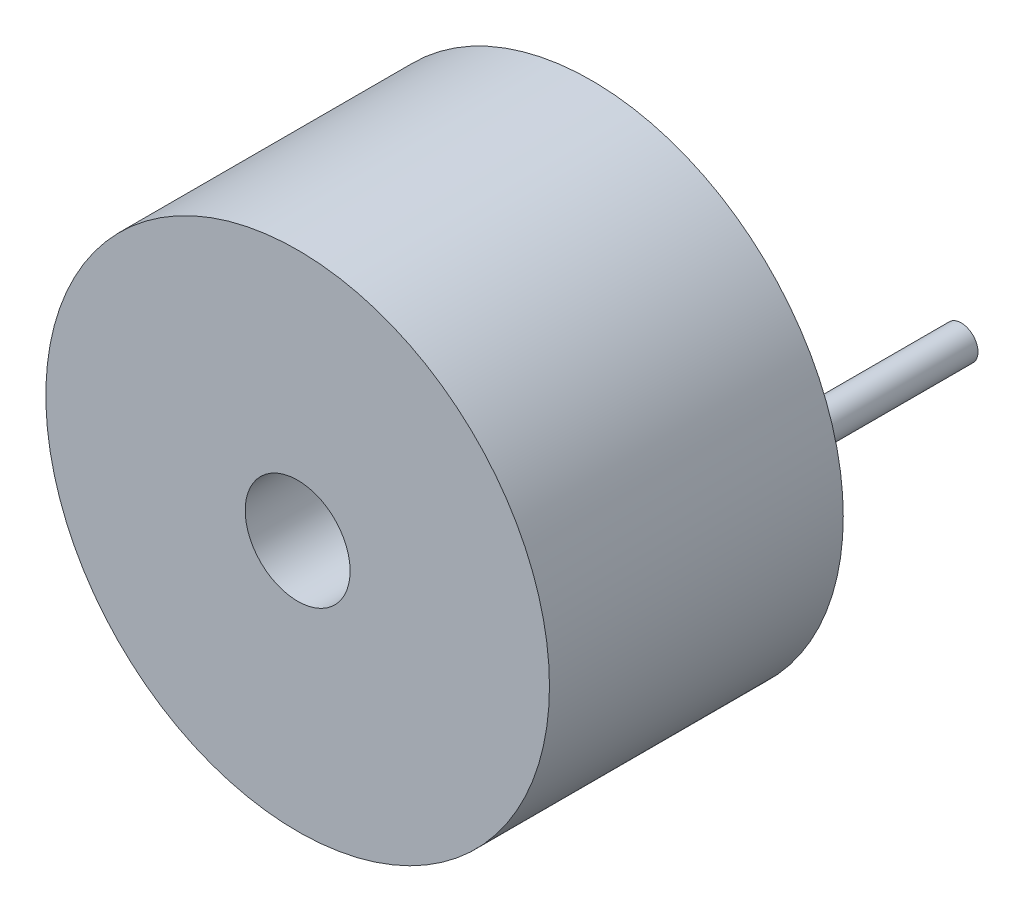
ISO-10303-21;
HEADER;
FILE_DESCRIPTION(('STEP AP214'),'2;1');
FILE_NAME('part.step','',(''),(''),'','','');
FILE_SCHEMA(('AUTOMOTIVE_DESIGN { 1 0 10303 214 1 1 1 1 }'));
ENDSEC;
DATA;
#1=APPLICATION_CONTEXT('core data for automotive mechanical design processes');
#2=APPLICATION_PROTOCOL_DEFINITION('international standard','automotive_design',2000,#1);
#3=PRODUCT_CONTEXT('',#1,'mechanical');
#4=PRODUCT('Part','Part','',(#3));
#5=PRODUCT_RELATED_PRODUCT_CATEGORY('part','',(#4));
#6=PRODUCT_DEFINITION_FORMATION('','',#4);
#7=PRODUCT_DEFINITION_CONTEXT('part definition',#1,'design');
#8=PRODUCT_DEFINITION('design','',#6,#7);
#9=PRODUCT_DEFINITION_SHAPE('','',#8);
#10=(LENGTH_UNIT() NAMED_UNIT(*) SI_UNIT(.MILLI.,.METRE.));
#11=(NAMED_UNIT(*) PLANE_ANGLE_UNIT() SI_UNIT($,.RADIAN.));
#12=(NAMED_UNIT(*) SI_UNIT($,.STERADIAN.) SOLID_ANGLE_UNIT());
#13=UNCERTAINTY_MEASURE_WITH_UNIT(LENGTH_MEASURE(1.E-05),#10,'distance_accuracy_value','');
#14=(GEOMETRIC_REPRESENTATION_CONTEXT(3) GLOBAL_UNCERTAINTY_ASSIGNED_CONTEXT((#13)) GLOBAL_UNIT_ASSIGNED_CONTEXT((#10,
#11,#12)) REPRESENTATION_CONTEXT('',''));
#15=CARTESIAN_POINT('',(0.,0.,0.));
#16=DIRECTION('',(0.,0.,1.));
#17=DIRECTION('',(1.,0.,0.));
#18=AXIS2_PLACEMENT_3D('',#15,#16,#17);
#19=CARTESIAN_POINT('',(0.,0.,0.));
#20=DIRECTION('',(0.,0.,1.));
#21=DIRECTION('',(1.,0.,0.));
#22=AXIS2_PLACEMENT_3D('',#19,#20,#21);
#23=PLANE('',#22);
#24=CARTESIAN_POINT('',(3.81,0.,0.));
#25=DIRECTION('',(0.,0.,1.));
#26=DIRECTION('',(1.,0.,0.));
#27=AXIS2_PLACEMENT_3D('',#24,#25,#26);
#28=CIRCLE('',#27,0.4);
#29=CARTESIAN_POINT('',(4.21,0.,0.));
#30=VERTEX_POINT('',#29);
#31=EDGE_CURVE('E41',#30,#30,#28,.F.);
#32=ORIENTED_EDGE('',*,*,#31,.F.);
#33=EDGE_LOOP('',(#32));
#34=FACE_BOUND('',#33,.T.);
#35=CARTESIAN_POINT('',(0.,0.,0.));
#36=DIRECTION('',(0.,0.,1.));
#37=DIRECTION('',(1.,0.,0.));
#38=AXIS2_PLACEMENT_3D('',#35,#36,#37);
#39=CIRCLE('',#38,6.);
#40=CARTESIAN_POINT('',(6.,0.,0.));
#41=VERTEX_POINT('',#40);
#42=EDGE_CURVE('E49',#41,#41,#39,.T.);
#43=ORIENTED_EDGE('',*,*,#42,.F.);
#44=EDGE_LOOP('',(#43));
#45=FACE_BOUND('',#44,.T.);
#46=CARTESIAN_POINT('',(-3.81,0.,0.));
#47=DIRECTION('',(0.,0.,1.));
#48=DIRECTION('',(1.,0.,0.));
#49=AXIS2_PLACEMENT_3D('',#46,#47,#48);
#50=CIRCLE('',#49,0.4);
#51=CARTESIAN_POINT('',(-3.41,0.,0.));
#52=VERTEX_POINT('',#51);
#53=EDGE_CURVE('E10',#52,#52,#50,.F.);
#54=ORIENTED_EDGE('',*,*,#53,.F.);
#55=EDGE_LOOP('',(#54));
#56=FACE_BOUND('',#55,.T.);
#57=ADVANCED_FACE('F34',(#34,#45,#56),#23,.F.);
#58=CARTESIAN_POINT('',(0.,0.,7.));
#59=DIRECTION('',(0.,0.,-1.));
#60=DIRECTION('',(-1.,0.,0.));
#61=AXIS2_PLACEMENT_3D('',#58,#59,#60);
#62=CYLINDRICAL_SURFACE('',#61,6.);
#63=CARTESIAN_POINT('',(0.,0.,7.));
#64=DIRECTION('',(0.,0.,1.));
#65=DIRECTION('',(1.,0.,0.));
#66=AXIS2_PLACEMENT_3D('',#63,#64,#65);
#67=CIRCLE('',#66,6.);
#68=CARTESIAN_POINT('',(6.,0.,7.));
#69=VERTEX_POINT('',#68);
#70=EDGE_CURVE('E45',#69,#69,#67,.T.);
#71=ORIENTED_EDGE('',*,*,#70,.F.);
#72=EDGE_LOOP('',(#71));
#73=FACE_BOUND('',#72,.T.);
#74=ORIENTED_EDGE('',*,*,#42,.T.);
#75=EDGE_LOOP('',(#74));
#76=FACE_BOUND('',#75,.T.);
#77=ADVANCED_FACE('F36',(#73,#76),#62,.T.);
#78=CARTESIAN_POINT('',(0.,0.,7.));
#79=DIRECTION('',(0.,0.,1.));
#80=DIRECTION('',(1.,0.,0.));
#81=AXIS2_PLACEMENT_3D('',#78,#79,#80);
#82=PLANE('',#81);
#83=CARTESIAN_POINT('',(0.,0.,7.));
#84=DIRECTION('',(0.,0.,1.));
#85=DIRECTION('',(1.,0.,0.));
#86=AXIS2_PLACEMENT_3D('',#83,#84,#85);
#87=CIRCLE('',#86,1.25);
#88=CARTESIAN_POINT('',(1.25,0.,7.));
#89=VERTEX_POINT('',#88);
#90=EDGE_CURVE('E63',#89,#89,#87,.T.);
#91=ORIENTED_EDGE('',*,*,#90,.F.);
#92=EDGE_LOOP('',(#91));
#93=FACE_BOUND('',#92,.T.);
#94=ORIENTED_EDGE('',*,*,#70,.T.);
#95=EDGE_LOOP('',(#94));
#96=FACE_BOUND('',#95,.T.);
#97=ADVANCED_FACE('F69',(#93,#96),#82,.T.);
#98=CARTESIAN_POINT('',(3.81,0.,-5.));
#99=DIRECTION('',(0.,0.,1.));
#100=DIRECTION('',(1.,0.,0.));
#101=AXIS2_PLACEMENT_3D('',#98,#99,#100);
#102=CYLINDRICAL_SURFACE('',#101,0.4);
#103=CARTESIAN_POINT('',(3.81,0.,-5.));
#104=DIRECTION('',(0.,0.,-1.));
#105=DIRECTION('',(-1.,0.,0.));
#106=AXIS2_PLACEMENT_3D('',#103,#104,#105);
#107=CIRCLE('',#106,0.4);
#108=CARTESIAN_POINT('',(3.41,0.,-5.));
#109=VERTEX_POINT('',#108);
#110=EDGE_CURVE('E54',#109,#109,#107,.T.);
#111=ORIENTED_EDGE('',*,*,#110,.F.);
#112=EDGE_LOOP('',(#111));
#113=FACE_BOUND('',#112,.T.);
#114=ORIENTED_EDGE('',*,*,#31,.T.);
#115=EDGE_LOOP('',(#114));
#116=FACE_BOUND('',#115,.T.);
#117=ADVANCED_FACE('F72',(#113,#116),#102,.T.);
#118=CARTESIAN_POINT('',(3.81,0.,-5.));
#119=DIRECTION('',(0.,0.,-1.));
#120=DIRECTION('',(-1.,0.,0.));
#121=AXIS2_PLACEMENT_3D('',#118,#119,#120);
#122=PLANE('',#121);
#123=ORIENTED_EDGE('',*,*,#110,.T.);
#124=EDGE_LOOP('',(#123));
#125=FACE_BOUND('',#124,.T.);
#126=ADVANCED_FACE('F88',(#125),#122,.T.);
#127=CARTESIAN_POINT('',(-3.81,0.,-5.));
#128=DIRECTION('',(0.,0.,1.));
#129=DIRECTION('',(1.,0.,0.));
#130=AXIS2_PLACEMENT_3D('',#127,#128,#129);
#131=CYLINDRICAL_SURFACE('',#130,0.4);
#132=CARTESIAN_POINT('',(-3.81,0.,-5.));
#133=DIRECTION('',(0.,0.,-1.));
#134=DIRECTION('',(1.,0.,0.));
#135=AXIS2_PLACEMENT_3D('',#132,#133,#134);
#136=CIRCLE('',#135,0.4);
#137=CARTESIAN_POINT('',(-3.41,0.,-5.));
#138=VERTEX_POINT('',#137);
#139=EDGE_CURVE('E57',#138,#138,#136,.T.);
#140=ORIENTED_EDGE('',*,*,#139,.F.);
#141=EDGE_LOOP('',(#140));
#142=FACE_BOUND('',#141,.T.);
#143=ORIENTED_EDGE('',*,*,#53,.T.);
#144=EDGE_LOOP('',(#143));
#145=FACE_BOUND('',#144,.T.);
#146=ADVANCED_FACE('F92',(#142,#145),#131,.T.);
#147=CARTESIAN_POINT('',(-3.81,0.,-5.));
#148=DIRECTION('',(0.,0.,1.));
#149=DIRECTION('',(1.,0.,0.));
#150=AXIS2_PLACEMENT_3D('',#147,#148,#149);
#151=PLANE('',#150);
#152=ORIENTED_EDGE('',*,*,#139,.T.);
#153=EDGE_LOOP('',(#152));
#154=FACE_BOUND('',#153,.T.);
#155=ADVANCED_FACE('F96',(#154),#151,.F.);
#156=CARTESIAN_POINT('',(0.,0.,2.));
#157=DIRECTION('',(0.,0.,1.));
#158=DIRECTION('',(1.,0.,0.));
#159=AXIS2_PLACEMENT_3D('',#156,#157,#158);
#160=CYLINDRICAL_SURFACE('',#159,1.25);
#161=CARTESIAN_POINT('',(0.,0.,2.));
#162=DIRECTION('',(0.,0.,1.));
#163=DIRECTION('',(1.,0.,0.));
#164=AXIS2_PLACEMENT_3D('',#161,#162,#163);
#165=CIRCLE('',#164,1.25);
#166=CARTESIAN_POINT('',(1.25,0.,2.));
#167=VERTEX_POINT('',#166);
#168=EDGE_CURVE('E60',#167,#167,#165,.T.);
#169=ORIENTED_EDGE('',*,*,#168,.F.);
#170=EDGE_LOOP('',(#169));
#171=FACE_BOUND('',#170,.T.);
#172=ORIENTED_EDGE('',*,*,#90,.T.);
#173=EDGE_LOOP('',(#172));
#174=FACE_BOUND('',#173,.T.);
#175=ADVANCED_FACE('F67',(#171,#174),#160,.F.);
#176=CARTESIAN_POINT('',(0.,0.,2.));
#177=DIRECTION('',(0.,0.,1.));
#178=DIRECTION('',(1.,0.,0.));
#179=AXIS2_PLACEMENT_3D('',#176,#177,#178);
#180=PLANE('',#179);
#181=ORIENTED_EDGE('',*,*,#168,.T.);
#182=EDGE_LOOP('',(#181));
#183=FACE_BOUND('',#182,.T.);
#184=ADVANCED_FACE('F103',(#183),#180,.T.);
#185=CLOSED_SHELL('',(#57,#77,#97,#117,#126,#146,#155,#175,#184));
#186=MANIFOLD_SOLID_BREP('B2',#185);
#187=ADVANCED_BREP_SHAPE_REPRESENTATION('',(#18,#186),#14);
#188=SHAPE_DEFINITION_REPRESENTATION(#9,#187);
ENDSEC;
END-ISO-10303-21;
